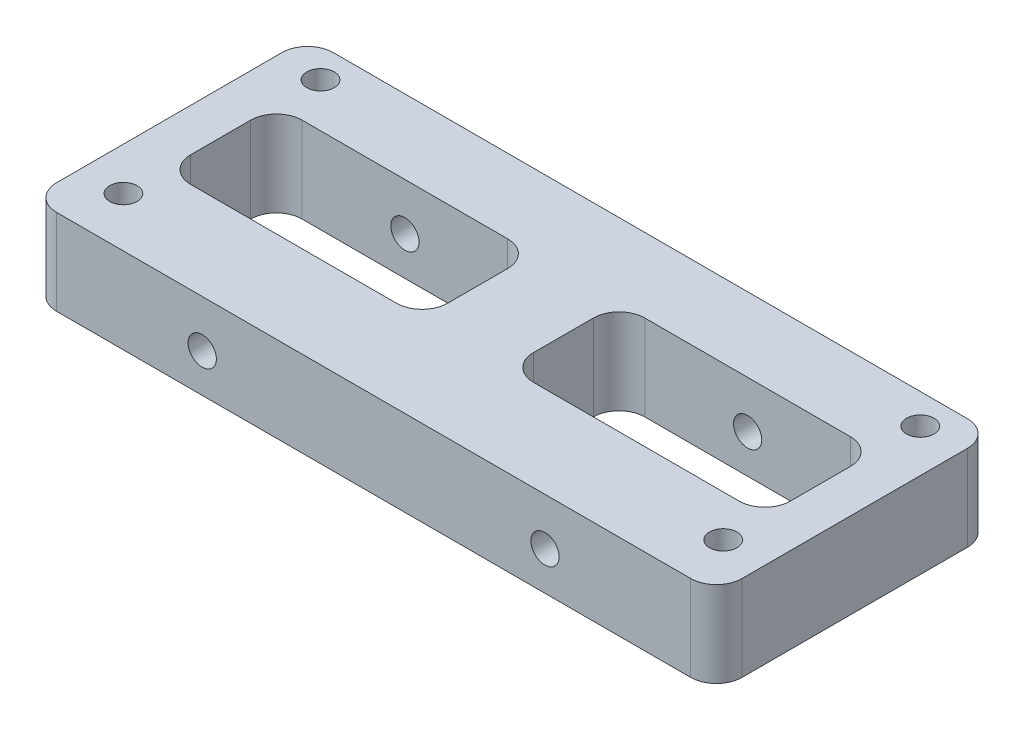
ISO-10303-21;
HEADER;
FILE_DESCRIPTION(('STEP AP214'),'2;1');
FILE_NAME('part.step','',(''),(''),'','','');
FILE_SCHEMA(('AUTOMOTIVE_DESIGN { 1 0 10303 214 1 1 1 1 }'));
ENDSEC;
DATA;
#1=APPLICATION_CONTEXT('core data for automotive mechanical design processes');
#2=APPLICATION_PROTOCOL_DEFINITION('international standard','automotive_design',2000,#1);
#3=PRODUCT_CONTEXT('',#1,'mechanical');
#4=PRODUCT('Part','Part','',(#3));
#5=PRODUCT_RELATED_PRODUCT_CATEGORY('part','',(#4));
#6=PRODUCT_DEFINITION_FORMATION('','',#4);
#7=PRODUCT_DEFINITION_CONTEXT('part definition',#1,'design');
#8=PRODUCT_DEFINITION('design','',#6,#7);
#9=PRODUCT_DEFINITION_SHAPE('','',#8);
#10=(LENGTH_UNIT() NAMED_UNIT(*) SI_UNIT(.MILLI.,.METRE.));
#11=(NAMED_UNIT(*) PLANE_ANGLE_UNIT() SI_UNIT($,.RADIAN.));
#12=(NAMED_UNIT(*) SI_UNIT($,.STERADIAN.) SOLID_ANGLE_UNIT());
#13=UNCERTAINTY_MEASURE_WITH_UNIT(LENGTH_MEASURE(1.E-05),#10,'distance_accuracy_value','');
#14=(GEOMETRIC_REPRESENTATION_CONTEXT(3) GLOBAL_UNCERTAINTY_ASSIGNED_CONTEXT((#13)) GLOBAL_UNIT_ASSIGNED_CONTEXT((#10,
#11,#12)) REPRESENTATION_CONTEXT('',''));
#15=CARTESIAN_POINT('',(0.,0.,0.));
#16=DIRECTION('',(0.,0.,1.));
#17=DIRECTION('',(1.,0.,0.));
#18=AXIS2_PLACEMENT_3D('',#15,#16,#17);
#19=CARTESIAN_POINT('',(20.,4.5,17.15));
#20=DIRECTION('',(0.,0.,-1.));
#21=DIRECTION('',(-1.,0.,0.));
#22=AXIS2_PLACEMENT_3D('',#19,#20,#21);
#23=CYLINDRICAL_SURFACE('',#22,1.65);
#24=CARTESIAN_POINT('',(20.,4.5,-6.49999999999998));
#25=DIRECTION('',(0.,0.,1.));
#26=DIRECTION('',(1.,0.,0.));
#27=AXIS2_PLACEMENT_3D('',#24,#25,#26);
#28=CIRCLE('',#27,1.65);
#29=CARTESIAN_POINT('',(21.65,4.5,-6.49999999999998));
#30=VERTEX_POINT('',#29);
#31=EDGE_CURVE('E412',#30,#30,#28,.T.);
#32=ORIENTED_EDGE('',*,*,#31,.T.);
#33=EDGE_LOOP('',(#32));
#34=FACE_BOUND('',#33,.T.);
#35=CARTESIAN_POINT('',(20.,4.5,-12.15));
#36=DIRECTION('',(0.,0.,-1.));
#37=DIRECTION('',(-1.,0.,0.));
#38=AXIS2_PLACEMENT_3D('',#35,#36,#37);
#39=CIRCLE('',#38,1.65);
#40=CARTESIAN_POINT('',(18.35,4.5,-12.15));
#41=VERTEX_POINT('',#40);
#42=EDGE_CURVE('E419',#41,#41,#39,.F.);
#43=ORIENTED_EDGE('',*,*,#42,.F.);
#44=EDGE_LOOP('',(#43));
#45=FACE_BOUND('',#44,.T.);
#46=ADVANCED_FACE('F41',(#34,#45),#23,.F.);
#47=CARTESIAN_POINT('',(0.,10.,0.));
#48=DIRECTION('',(0.,-1.,0.));
#49=DIRECTION('',(0.,0.,-1.));
#50=AXIS2_PLACEMENT_3D('',#47,#48,#49);
#51=PLANE('',#50);
#52=DIRECTION('',(0.,0.,1.));
#53=VECTOR('',#52,1.);
#54=CARTESIAN_POINT('',(-35.,10.,-6.49999999999998));
#55=LINE('',#54,#53);
#56=CARTESIAN_POINT('',(-35.,10.,-3.49999999999998));
#57=VERTEX_POINT('',#56);
#58=CARTESIAN_POINT('',(-35.,10.,3.5));
#59=VERTEX_POINT('',#58);
#60=EDGE_CURVE('E357',#57,#59,#55,.T.);
#61=ORIENTED_EDGE('',*,*,#60,.F.);
#62=CARTESIAN_POINT('',(-32.,10.,-3.49999999999998));
#63=DIRECTION('',(0.,-1.,0.));
#64=DIRECTION('',(0.,0.,-1.));
#65=AXIS2_PLACEMENT_3D('',#62,#63,#64);
#66=CIRCLE('',#65,3.);
#67=CARTESIAN_POINT('',(-32.,10.,-6.49999999999998));
#68=VERTEX_POINT('',#67);
#69=EDGE_CURVE('E11',#57,#68,#66,.T.);
#70=ORIENTED_EDGE('',*,*,#69,.T.);
#71=DIRECTION('',(-1.,0.,0.));
#72=VECTOR('',#71,1.);
#73=CARTESIAN_POINT('',(-35.,10.,-6.49999999999998));
#74=LINE('',#73,#72);
#75=CARTESIAN_POINT('',(-8.,10.,-6.49999999999998));
#76=VERTEX_POINT('',#75);
#77=EDGE_CURVE('E355',#76,#68,#74,.T.);
#78=ORIENTED_EDGE('',*,*,#77,.F.);
#79=CARTESIAN_POINT('',(-8.,10.,-3.49999999999998));
#80=DIRECTION('',(0.,-1.,0.));
#81=DIRECTION('',(0.,0.,-1.));
#82=AXIS2_PLACEMENT_3D('',#79,#80,#81);
#83=CIRCLE('',#82,3.);
#84=CARTESIAN_POINT('',(-5.,10.,-3.49999999999999));
#85=VERTEX_POINT('',#84);
#86=EDGE_CURVE('E329',#76,#85,#83,.T.);
#87=ORIENTED_EDGE('',*,*,#86,.T.);
#88=DIRECTION('',(0.,0.,-1.));
#89=VECTOR('',#88,1.);
#90=CARTESIAN_POINT('',(-5.,10.,-6.49999999999998));
#91=LINE('',#90,#89);
#92=CARTESIAN_POINT('',(-5.,10.,3.49999999999999));
#93=VERTEX_POINT('',#92);
#94=EDGE_CURVE('E362',#93,#85,#91,.T.);
#95=ORIENTED_EDGE('',*,*,#94,.F.);
#96=CARTESIAN_POINT('',(-8.,10.,3.5));
#97=DIRECTION('',(0.,-1.,0.));
#98=DIRECTION('',(0.,0.,-1.));
#99=AXIS2_PLACEMENT_3D('',#96,#97,#98);
#100=CIRCLE('',#99,3.);
#101=CARTESIAN_POINT('',(-8.,10.,6.5));
#102=VERTEX_POINT('',#101);
#103=EDGE_CURVE('E325',#93,#102,#100,.T.);
#104=ORIENTED_EDGE('',*,*,#103,.T.);
#105=DIRECTION('',(1.,0.,0.));
#106=VECTOR('',#105,1.);
#107=CARTESIAN_POINT('',(-35.,10.,6.50000000000001));
#108=LINE('',#107,#106);
#109=CARTESIAN_POINT('',(-32.,10.,6.5));
#110=VERTEX_POINT('',#109);
#111=EDGE_CURVE('E368',#110,#102,#108,.T.);
#112=ORIENTED_EDGE('',*,*,#111,.F.);
#113=CARTESIAN_POINT('',(-32.,10.,3.5));
#114=DIRECTION('',(0.,-1.,0.));
#115=DIRECTION('',(0.,0.,-1.));
#116=AXIS2_PLACEMENT_3D('',#113,#114,#115);
#117=CIRCLE('',#116,3.);
#118=EDGE_CURVE('E321',#110,#59,#117,.T.);
#119=ORIENTED_EDGE('',*,*,#118,.T.);
#120=EDGE_LOOP('',(#61,#70,#78,#87,#95,#104,#112,#119));
#121=FACE_BOUND('',#120,.T.);
#122=DIRECTION('',(1.,0.,0.));
#123=VECTOR('',#122,1.);
#124=CARTESIAN_POINT('',(-40.,10.,17.15));
#125=LINE('',#124,#123);
#126=CARTESIAN_POINT('',(-37.,10.,17.15));
#127=VERTEX_POINT('',#126);
#128=CARTESIAN_POINT('',(37.,10.,17.15));
#129=VERTEX_POINT('',#128);
#130=EDGE_CURVE('E229',#127,#129,#125,.T.);
#131=ORIENTED_EDGE('',*,*,#130,.T.);
#132=CARTESIAN_POINT('',(37.,10.,14.15));
#133=DIRECTION('',(0.,-1.,0.));
#134=DIRECTION('',(0.,0.,-1.));
#135=AXIS2_PLACEMENT_3D('',#132,#133,#134);
#136=CIRCLE('',#135,3.);
#137=CARTESIAN_POINT('',(40.,10.,14.15));
#138=VERTEX_POINT('',#137);
#139=EDGE_CURVE('E297',#129,#138,#136,.F.);
#140=ORIENTED_EDGE('',*,*,#139,.T.);
#141=DIRECTION('',(0.,0.,-1.));
#142=VECTOR('',#141,1.);
#143=CARTESIAN_POINT('',(40.,10.,17.15));
#144=LINE('',#143,#142);
#145=CARTESIAN_POINT('',(40.,10.,-12.15));
#146=VERTEX_POINT('',#145);
#147=EDGE_CURVE('E398',#138,#146,#144,.T.);
#148=ORIENTED_EDGE('',*,*,#147,.T.);
#149=CARTESIAN_POINT('',(37.,10.,-12.15));
#150=DIRECTION('',(0.,-1.,0.));
#151=DIRECTION('',(0.,0.,-1.));
#152=AXIS2_PLACEMENT_3D('',#149,#150,#151);
#153=CIRCLE('',#152,3.);
#154=CARTESIAN_POINT('',(37.,10.,-15.15));
#155=VERTEX_POINT('',#154);
#156=EDGE_CURVE('E293',#146,#155,#153,.F.);
#157=ORIENTED_EDGE('',*,*,#156,.T.);
#158=DIRECTION('',(1.,0.,0.));
#159=VECTOR('',#158,1.);
#160=CARTESIAN_POINT('',(-40.,10.,-15.15));
#161=LINE('',#160,#159);
#162=CARTESIAN_POINT('',(-37.,10.,-15.15));
#163=VERTEX_POINT('',#162);
#164=EDGE_CURVE('E536',#163,#155,#161,.T.);
#165=ORIENTED_EDGE('',*,*,#164,.F.);
#166=CARTESIAN_POINT('',(-37.,10.,-12.15));
#167=DIRECTION('',(0.,-1.,0.));
#168=DIRECTION('',(0.,0.,-1.));
#169=AXIS2_PLACEMENT_3D('',#166,#167,#168);
#170=CIRCLE('',#169,3.);
#171=CARTESIAN_POINT('',(-40.,10.,-12.15));
#172=VERTEX_POINT('',#171);
#173=EDGE_CURVE('E63',#163,#172,#170,.F.);
#174=ORIENTED_EDGE('',*,*,#173,.T.);
#175=DIRECTION('',(0.,0.,1.));
#176=VECTOR('',#175,1.);
#177=CARTESIAN_POINT('',(-40.,10.,17.15));
#178=LINE('',#177,#176);
#179=CARTESIAN_POINT('',(-40.,10.,14.15));
#180=VERTEX_POINT('',#179);
#181=EDGE_CURVE('E234',#172,#180,#178,.T.);
#182=ORIENTED_EDGE('',*,*,#181,.T.);
#183=CARTESIAN_POINT('',(-37.,10.,14.15));
#184=DIRECTION('',(0.,-1.,0.));
#185=DIRECTION('',(0.,0.,-1.));
#186=AXIS2_PLACEMENT_3D('',#183,#184,#185);
#187=CIRCLE('',#186,3.);
#188=EDGE_CURVE('E295',#180,#127,#187,.F.);
#189=ORIENTED_EDGE('',*,*,#188,.T.);
#190=EDGE_LOOP('',(#131,#140,#148,#157,#165,#174,#182,#189));
#191=FACE_BOUND('',#190,.T.);
#192=CARTESIAN_POINT('',(-35.,10.,11.35));
#193=DIRECTION('',(0.,1.,0.));
#194=DIRECTION('',(0.,0.,1.));
#195=AXIS2_PLACEMENT_3D('',#192,#193,#194);
#196=CIRCLE('',#195,1.6);
#197=CARTESIAN_POINT('',(-35.,10.,12.95));
#198=VERTEX_POINT('',#197);
#199=EDGE_CURVE('E392',#198,#198,#196,.T.);
#200=ORIENTED_EDGE('',*,*,#199,.F.);
#201=EDGE_LOOP('',(#200));
#202=FACE_BOUND('',#201,.T.);
#203=CARTESIAN_POINT('',(-35.,10.,-11.65));
#204=DIRECTION('',(0.,1.,0.));
#205=DIRECTION('',(0.,0.,1.));
#206=AXIS2_PLACEMENT_3D('',#203,#204,#205);
#207=CIRCLE('',#206,1.6);
#208=CARTESIAN_POINT('',(-35.,10.,-10.05));
#209=VERTEX_POINT('',#208);
#210=EDGE_CURVE('E386',#209,#209,#207,.T.);
#211=ORIENTED_EDGE('',*,*,#210,.F.);
#212=EDGE_LOOP('',(#211));
#213=FACE_BOUND('',#212,.T.);
#214=CARTESIAN_POINT('',(35.,10.,11.35));
#215=DIRECTION('',(0.,1.,0.));
#216=DIRECTION('',(0.,0.,-1.));
#217=AXIS2_PLACEMENT_3D('',#214,#215,#216);
#218=CIRCLE('',#217,1.6);
#219=CARTESIAN_POINT('',(35.,10.,9.75000000000001));
#220=VERTEX_POINT('',#219);
#221=EDGE_CURVE('E380',#220,#220,#218,.T.);
#222=ORIENTED_EDGE('',*,*,#221,.F.);
#223=EDGE_LOOP('',(#222));
#224=FACE_BOUND('',#223,.T.);
#225=CARTESIAN_POINT('',(35.,10.,-11.65));
#226=DIRECTION('',(0.,1.,0.));
#227=DIRECTION('',(0.,0.,-1.));
#228=AXIS2_PLACEMENT_3D('',#225,#226,#227);
#229=CIRCLE('',#228,1.6);
#230=CARTESIAN_POINT('',(35.,10.,-13.25));
#231=VERTEX_POINT('',#230);
#232=EDGE_CURVE('E365',#231,#231,#229,.T.);
#233=ORIENTED_EDGE('',*,*,#232,.F.);
#234=EDGE_LOOP('',(#233));
#235=FACE_BOUND('',#234,.T.);
#236=DIRECTION('',(-1.,0.,0.));
#237=VECTOR('',#236,1.);
#238=CARTESIAN_POINT('',(35.,10.,-6.49999999999998));
#239=LINE('',#238,#237);
#240=CARTESIAN_POINT('',(32.,10.,-6.49999999999998));
#241=VERTEX_POINT('',#240);
#242=CARTESIAN_POINT('',(8.,10.,-6.49999999999998));
#243=VERTEX_POINT('',#242);
#244=EDGE_CURVE('E437',#241,#243,#239,.T.);
#245=ORIENTED_EDGE('',*,*,#244,.F.);
#246=CARTESIAN_POINT('',(32.,10.,-3.49999999999998));
#247=DIRECTION('',(0.,-1.,0.));
#248=DIRECTION('',(0.,0.,-1.));
#249=AXIS2_PLACEMENT_3D('',#246,#247,#248);
#250=CIRCLE('',#249,3.);
#251=CARTESIAN_POINT('',(35.,10.,-3.49999999999998));
#252=VERTEX_POINT('',#251);
#253=EDGE_CURVE('E213',#241,#252,#250,.T.);
#254=ORIENTED_EDGE('',*,*,#253,.T.);
#255=DIRECTION('',(0.,0.,-1.));
#256=VECTOR('',#255,1.);
#257=CARTESIAN_POINT('',(35.,10.,-6.49999999999998));
#258=LINE('',#257,#256);
#259=CARTESIAN_POINT('',(35.,10.,3.5));
#260=VERTEX_POINT('',#259);
#261=EDGE_CURVE('E347',#260,#252,#258,.T.);
#262=ORIENTED_EDGE('',*,*,#261,.F.);
#263=CARTESIAN_POINT('',(32.,10.,3.5));
#264=DIRECTION('',(0.,-1.,0.));
#265=DIRECTION('',(0.,0.,-1.));
#266=AXIS2_PLACEMENT_3D('',#263,#264,#265);
#267=CIRCLE('',#266,3.);
#268=CARTESIAN_POINT('',(32.,10.,6.5));
#269=VERTEX_POINT('',#268);
#270=EDGE_CURVE('E214',#260,#269,#267,.T.);
#271=ORIENTED_EDGE('',*,*,#270,.T.);
#272=DIRECTION('',(1.,0.,0.));
#273=VECTOR('',#272,1.);
#274=CARTESIAN_POINT('',(35.,10.,6.50000000000001));
#275=LINE('',#274,#273);
#276=CARTESIAN_POINT('',(8.,10.,6.5));
#277=VERTEX_POINT('',#276);
#278=EDGE_CURVE('E442',#277,#269,#275,.T.);
#279=ORIENTED_EDGE('',*,*,#278,.F.);
#280=CARTESIAN_POINT('',(8.,10.,3.5));
#281=DIRECTION('',(0.,-1.,0.));
#282=DIRECTION('',(0.,0.,-1.));
#283=AXIS2_PLACEMENT_3D('',#280,#281,#282);
#284=CIRCLE('',#283,3.);
#285=CARTESIAN_POINT('',(5.,10.,3.49999999999999));
#286=VERTEX_POINT('',#285);
#287=EDGE_CURVE('E313',#277,#286,#284,.T.);
#288=ORIENTED_EDGE('',*,*,#287,.T.);
#289=DIRECTION('',(0.,0.,1.));
#290=VECTOR('',#289,1.);
#291=CARTESIAN_POINT('',(5.,10.,-6.49999999999998));
#292=LINE('',#291,#290);
#293=CARTESIAN_POINT('',(5.,10.,-3.49999999999999));
#294=VERTEX_POINT('',#293);
#295=EDGE_CURVE('E439',#294,#286,#292,.T.);
#296=ORIENTED_EDGE('',*,*,#295,.F.);
#297=CARTESIAN_POINT('',(8.,10.,-3.49999999999998));
#298=DIRECTION('',(0.,-1.,0.));
#299=DIRECTION('',(0.,0.,-1.));
#300=AXIS2_PLACEMENT_3D('',#297,#298,#299);
#301=CIRCLE('',#300,3.);
#302=EDGE_CURVE('E309',#294,#243,#301,.T.);
#303=ORIENTED_EDGE('',*,*,#302,.T.);
#304=EDGE_LOOP('',(#245,#254,#262,#271,#279,#288,#296,#303));
#305=FACE_BOUND('',#304,.T.);
#306=ADVANCED_FACE('F354',(#121,#191,#202,#213,#224,#235,#305),#51,.F.);
#307=CARTESIAN_POINT('',(0.,0.,0.));
#308=DIRECTION('',(0.,-1.,0.));
#309=DIRECTION('',(0.,0.,-1.));
#310=AXIS2_PLACEMENT_3D('',#307,#308,#309);
#311=PLANE('',#310);
#312=DIRECTION('',(0.,0.,-1.));
#313=VECTOR('',#312,1.);
#314=CARTESIAN_POINT('',(40.,0.,17.15));
#315=LINE('',#314,#313);
#316=CARTESIAN_POINT('',(40.,0.,14.15));
#317=VERTEX_POINT('',#316);
#318=CARTESIAN_POINT('',(40.,0.,-12.15));
#319=VERTEX_POINT('',#318);
#320=EDGE_CURVE('E395',#317,#319,#315,.T.);
#321=ORIENTED_EDGE('',*,*,#320,.F.);
#322=CARTESIAN_POINT('',(37.,0.,14.15));
#323=DIRECTION('',(0.,-1.,0.));
#324=DIRECTION('',(0.,0.,-1.));
#325=AXIS2_PLACEMENT_3D('',#322,#323,#324);
#326=CIRCLE('',#325,3.);
#327=CARTESIAN_POINT('',(37.,0.,17.15));
#328=VERTEX_POINT('',#327);
#329=EDGE_CURVE('E285',#317,#328,#326,.T.);
#330=ORIENTED_EDGE('',*,*,#329,.T.);
#331=DIRECTION('',(1.,0.,0.));
#332=VECTOR('',#331,1.);
#333=CARTESIAN_POINT('',(20.,0.,17.15));
#334=LINE('',#333,#332);
#335=CARTESIAN_POINT('',(-37.,0.,17.15));
#336=VERTEX_POINT('',#335);
#337=EDGE_CURVE('E401',#336,#328,#334,.T.);
#338=ORIENTED_EDGE('',*,*,#337,.F.);
#339=CARTESIAN_POINT('',(-37.,0.,14.15));
#340=DIRECTION('',(0.,-1.,0.));
#341=DIRECTION('',(0.,0.,-1.));
#342=AXIS2_PLACEMENT_3D('',#339,#340,#341);
#343=CIRCLE('',#342,3.);
#344=CARTESIAN_POINT('',(-40.,0.,14.15));
#345=VERTEX_POINT('',#344);
#346=EDGE_CURVE('E283',#336,#345,#343,.T.);
#347=ORIENTED_EDGE('',*,*,#346,.T.);
#348=DIRECTION('',(0.,0.,1.));
#349=VECTOR('',#348,1.);
#350=CARTESIAN_POINT('',(-40.,0.,17.15));
#351=LINE('',#350,#349);
#352=CARTESIAN_POINT('',(-40.,0.,-12.15));
#353=VERTEX_POINT('',#352);
#354=EDGE_CURVE('E405',#353,#345,#351,.T.);
#355=ORIENTED_EDGE('',*,*,#354,.F.);
#356=CARTESIAN_POINT('',(-37.,0.,-12.15));
#357=DIRECTION('',(0.,-1.,0.));
#358=DIRECTION('',(0.,0.,-1.));
#359=AXIS2_PLACEMENT_3D('',#356,#357,#358);
#360=CIRCLE('',#359,3.);
#361=CARTESIAN_POINT('',(-37.,0.,-15.15));
#362=VERTEX_POINT('',#361);
#363=EDGE_CURVE('E279',#353,#362,#360,.T.);
#364=ORIENTED_EDGE('',*,*,#363,.T.);
#365=DIRECTION('',(1.,0.,0.));
#366=VECTOR('',#365,1.);
#367=CARTESIAN_POINT('',(-40.,0.,-15.15));
#368=LINE('',#367,#366);
#369=CARTESIAN_POINT('',(37.,0.,-15.15));
#370=VERTEX_POINT('',#369);
#371=EDGE_CURVE('E543',#362,#370,#368,.T.);
#372=ORIENTED_EDGE('',*,*,#371,.T.);
#373=CARTESIAN_POINT('',(37.,0.,-12.15));
#374=DIRECTION('',(0.,-1.,0.));
#375=DIRECTION('',(0.,0.,-1.));
#376=AXIS2_PLACEMENT_3D('',#373,#374,#375);
#377=CIRCLE('',#376,3.);
#378=EDGE_CURVE('E281',#370,#319,#377,.T.);
#379=ORIENTED_EDGE('',*,*,#378,.T.);
#380=EDGE_LOOP('',(#321,#330,#338,#347,#355,#364,#372,#379));
#381=FACE_BOUND('',#380,.T.);
#382=CARTESIAN_POINT('',(35.,0.,11.35));
#383=DIRECTION('',(0.,1.,0.));
#384=DIRECTION('',(0.,0.,-1.));
#385=AXIS2_PLACEMENT_3D('',#382,#383,#384);
#386=CIRCLE('',#385,1.6);
#387=CARTESIAN_POINT('',(35.,0.,9.75000000000001));
#388=VERTEX_POINT('',#387);
#389=EDGE_CURVE('E378',#388,#388,#386,.T.);
#390=ORIENTED_EDGE('',*,*,#389,.T.);
#391=EDGE_LOOP('',(#390));
#392=FACE_BOUND('',#391,.T.);
#393=CARTESIAN_POINT('',(-35.,0.,11.35));
#394=DIRECTION('',(0.,1.,0.));
#395=DIRECTION('',(0.,0.,1.));
#396=AXIS2_PLACEMENT_3D('',#393,#394,#395);
#397=CIRCLE('',#396,1.6);
#398=CARTESIAN_POINT('',(-35.,0.,12.95));
#399=VERTEX_POINT('',#398);
#400=EDGE_CURVE('E389',#399,#399,#397,.T.);
#401=ORIENTED_EDGE('',*,*,#400,.T.);
#402=EDGE_LOOP('',(#401));
#403=FACE_BOUND('',#402,.T.);
#404=CARTESIAN_POINT('',(-35.,0.,-11.65));
#405=DIRECTION('',(0.,1.,0.));
#406=DIRECTION('',(0.,0.,1.));
#407=AXIS2_PLACEMENT_3D('',#404,#405,#406);
#408=CIRCLE('',#407,1.6);
#409=CARTESIAN_POINT('',(-35.,0.,-10.05));
#410=VERTEX_POINT('',#409);
#411=EDGE_CURVE('E383',#410,#410,#408,.T.);
#412=ORIENTED_EDGE('',*,*,#411,.T.);
#413=EDGE_LOOP('',(#412));
#414=FACE_BOUND('',#413,.T.);
#415=CARTESIAN_POINT('',(35.,0.,-11.65));
#416=DIRECTION('',(0.,1.,0.));
#417=DIRECTION('',(0.,0.,-1.));
#418=AXIS2_PLACEMENT_3D('',#415,#416,#417);
#419=CIRCLE('',#418,1.6);
#420=CARTESIAN_POINT('',(35.,0.,-13.25));
#421=VERTEX_POINT('',#420);
#422=EDGE_CURVE('E361',#421,#421,#419,.T.);
#423=ORIENTED_EDGE('',*,*,#422,.T.);
#424=EDGE_LOOP('',(#423));
#425=FACE_BOUND('',#424,.T.);
#426=DIRECTION('',(0.,0.,-1.));
#427=VECTOR('',#426,1.);
#428=CARTESIAN_POINT('',(-5.,0.,-6.49999999999998));
#429=LINE('',#428,#427);
#430=CARTESIAN_POINT('',(-5.,0.,3.49999999999999));
#431=VERTEX_POINT('',#430);
#432=CARTESIAN_POINT('',(-5.,0.,-3.49999999999999));
#433=VERTEX_POINT('',#432);
#434=EDGE_CURVE('E374',#431,#433,#429,.T.);
#435=ORIENTED_EDGE('',*,*,#434,.T.);
#436=CARTESIAN_POINT('',(-8.,0.,-3.49999999999998));
#437=DIRECTION('',(0.,-1.,0.));
#438=DIRECTION('',(0.,0.,-1.));
#439=AXIS2_PLACEMENT_3D('',#436,#437,#438);
#440=CIRCLE('',#439,3.);
#441=CARTESIAN_POINT('',(-8.,0.,-6.49999999999998));
#442=VERTEX_POINT('',#441);
#443=EDGE_CURVE('E327',#433,#442,#440,.F.);
#444=ORIENTED_EDGE('',*,*,#443,.T.);
#445=DIRECTION('',(-1.,0.,0.));
#446=VECTOR('',#445,1.);
#447=CARTESIAN_POINT('',(-35.,0.,-6.49999999999998));
#448=LINE('',#447,#446);
#449=CARTESIAN_POINT('',(-32.,0.,-6.49999999999998));
#450=VERTEX_POINT('',#449);
#451=EDGE_CURVE('E337',#442,#450,#448,.T.);
#452=ORIENTED_EDGE('',*,*,#451,.T.);
#453=CARTESIAN_POINT('',(-32.,0.,-3.49999999999998));
#454=DIRECTION('',(0.,-1.,0.));
#455=DIRECTION('',(0.,0.,-1.));
#456=AXIS2_PLACEMENT_3D('',#453,#454,#455);
#457=CIRCLE('',#456,3.);
#458=CARTESIAN_POINT('',(-35.,0.,-3.49999999999998));
#459=VERTEX_POINT('',#458);
#460=EDGE_CURVE('E49',#450,#459,#457,.F.);
#461=ORIENTED_EDGE('',*,*,#460,.T.);
#462=DIRECTION('',(0.,0.,1.));
#463=VECTOR('',#462,1.);
#464=CARTESIAN_POINT('',(-35.,0.,-6.49999999999998));
#465=LINE('',#464,#463);
#466=CARTESIAN_POINT('',(-35.,0.,3.5));
#467=VERTEX_POINT('',#466);
#468=EDGE_CURVE('E335',#459,#467,#465,.T.);
#469=ORIENTED_EDGE('',*,*,#468,.T.);
#470=CARTESIAN_POINT('',(-32.,0.,3.5));
#471=DIRECTION('',(0.,-1.,0.));
#472=DIRECTION('',(0.,0.,-1.));
#473=AXIS2_PLACEMENT_3D('',#470,#471,#472);
#474=CIRCLE('',#473,3.);
#475=CARTESIAN_POINT('',(-32.,0.,6.5));
#476=VERTEX_POINT('',#475);
#477=EDGE_CURVE('E319',#467,#476,#474,.F.);
#478=ORIENTED_EDGE('',*,*,#477,.T.);
#479=DIRECTION('',(1.,0.,0.));
#480=VECTOR('',#479,1.);
#481=CARTESIAN_POINT('',(-35.,0.,6.50000000000001));
#482=LINE('',#481,#480);
#483=CARTESIAN_POINT('',(-8.,0.,6.5));
#484=VERTEX_POINT('',#483);
#485=EDGE_CURVE('E346',#476,#484,#482,.T.);
#486=ORIENTED_EDGE('',*,*,#485,.T.);
#487=CARTESIAN_POINT('',(-8.,0.,3.5));
#488=DIRECTION('',(0.,-1.,0.));
#489=DIRECTION('',(0.,0.,-1.));
#490=AXIS2_PLACEMENT_3D('',#487,#488,#489);
#491=CIRCLE('',#490,3.);
#492=EDGE_CURVE('E323',#484,#431,#491,.F.);
#493=ORIENTED_EDGE('',*,*,#492,.T.);
#494=EDGE_LOOP('',(#435,#444,#452,#461,#469,#478,#486,#493));
#495=FACE_BOUND('',#494,.T.);
#496=DIRECTION('',(1.,0.,0.));
#497=VECTOR('',#496,1.);
#498=CARTESIAN_POINT('',(35.,0.,6.50000000000001));
#499=LINE('',#498,#497);
#500=CARTESIAN_POINT('',(8.,0.,6.5));
#501=VERTEX_POINT('',#500);
#502=CARTESIAN_POINT('',(32.,0.,6.5));
#503=VERTEX_POINT('',#502);
#504=EDGE_CURVE('E449',#501,#503,#499,.T.);
#505=ORIENTED_EDGE('',*,*,#504,.T.);
#506=CARTESIAN_POINT('',(32.,0.,3.5));
#507=DIRECTION('',(0.,-1.,0.));
#508=DIRECTION('',(0.,0.,-1.));
#509=AXIS2_PLACEMENT_3D('',#506,#507,#508);
#510=CIRCLE('',#509,3.);
#511=CARTESIAN_POINT('',(35.,0.,3.5));
#512=VERTEX_POINT('',#511);
#513=EDGE_CURVE('E315',#503,#512,#510,.F.);
#514=ORIENTED_EDGE('',*,*,#513,.T.);
#515=DIRECTION('',(0.,0.,-1.));
#516=VECTOR('',#515,1.);
#517=CARTESIAN_POINT('',(35.,0.,-6.49999999999998));
#518=LINE('',#517,#516);
#519=CARTESIAN_POINT('',(35.,0.,-3.49999999999998));
#520=VERTEX_POINT('',#519);
#521=EDGE_CURVE('E208',#512,#520,#518,.T.);
#522=ORIENTED_EDGE('',*,*,#521,.T.);
#523=CARTESIAN_POINT('',(32.,0.,-3.49999999999998));
#524=DIRECTION('',(0.,-1.,0.));
#525=DIRECTION('',(0.,0.,-1.));
#526=AXIS2_PLACEMENT_3D('',#523,#524,#525);
#527=CIRCLE('',#526,3.);
#528=CARTESIAN_POINT('',(32.,0.,-6.49999999999998));
#529=VERTEX_POINT('',#528);
#530=EDGE_CURVE('E202',#520,#529,#527,.F.);
#531=ORIENTED_EDGE('',*,*,#530,.T.);
#532=DIRECTION('',(-1.,0.,0.));
#533=VECTOR('',#532,1.);
#534=CARTESIAN_POINT('',(35.,0.,-6.49999999999998));
#535=LINE('',#534,#533);
#536=CARTESIAN_POINT('',(8.,0.,-6.49999999999998));
#537=VERTEX_POINT('',#536);
#538=EDGE_CURVE('E206',#529,#537,#535,.T.);
#539=ORIENTED_EDGE('',*,*,#538,.T.);
#540=CARTESIAN_POINT('',(8.,0.,-3.49999999999998));
#541=DIRECTION('',(0.,-1.,0.));
#542=DIRECTION('',(0.,0.,-1.));
#543=AXIS2_PLACEMENT_3D('',#540,#541,#542);
#544=CIRCLE('',#543,3.);
#545=CARTESIAN_POINT('',(5.,0.,-3.49999999999999));
#546=VERTEX_POINT('',#545);
#547=EDGE_CURVE('E307',#537,#546,#544,.F.);
#548=ORIENTED_EDGE('',*,*,#547,.T.);
#549=DIRECTION('',(0.,0.,1.));
#550=VECTOR('',#549,1.);
#551=CARTESIAN_POINT('',(5.,0.,-6.49999999999998));
#552=LINE('',#551,#550);
#553=CARTESIAN_POINT('',(5.,0.,3.49999999999999));
#554=VERTEX_POINT('',#553);
#555=EDGE_CURVE('E224',#546,#554,#552,.T.);
#556=ORIENTED_EDGE('',*,*,#555,.T.);
#557=CARTESIAN_POINT('',(8.,0.,3.5));
#558=DIRECTION('',(0.,-1.,0.));
#559=DIRECTION('',(0.,0.,-1.));
#560=AXIS2_PLACEMENT_3D('',#557,#558,#559);
#561=CIRCLE('',#560,3.);
#562=EDGE_CURVE('E311',#554,#501,#561,.F.);
#563=ORIENTED_EDGE('',*,*,#562,.T.);
#564=EDGE_LOOP('',(#505,#514,#522,#531,#539,#548,#556,#563));
#565=FACE_BOUND('',#564,.T.);
#566=ADVANCED_FACE('F205',(#381,#392,#403,#414,#425,#495,#565),#311,.T.);
#567=CARTESIAN_POINT('',(40.,10.,17.15));
#568=DIRECTION('',(-1.,0.,0.));
#569=DIRECTION('',(0.,0.,1.));
#570=AXIS2_PLACEMENT_3D('',#567,#568,#569);
#571=PLANE('',#570);
#572=ORIENTED_EDGE('',*,*,#147,.F.);
#573=DIRECTION('',(0.,-1.,0.));
#574=VECTOR('',#573,1.);
#575=CARTESIAN_POINT('',(40.,10.,14.15));
#576=LINE('',#575,#574);
#577=EDGE_CURVE('E276',#138,#317,#576,.T.);
#578=ORIENTED_EDGE('',*,*,#577,.T.);
#579=ORIENTED_EDGE('',*,*,#320,.T.);
#580=DIRECTION('',(0.,1.,0.));
#581=VECTOR('',#580,1.);
#582=CARTESIAN_POINT('',(40.,10.,-12.15));
#583=LINE('',#582,#581);
#584=EDGE_CURVE('E273',#319,#146,#583,.T.);
#585=ORIENTED_EDGE('',*,*,#584,.T.);
#586=EDGE_LOOP('',(#572,#578,#579,#585));
#587=FACE_BOUND('',#586,.T.);
#588=ADVANCED_FACE('F528',(#587),#571,.F.);
#589=CARTESIAN_POINT('',(-40.,10.,17.15));
#590=DIRECTION('',(1.,0.,0.));
#591=DIRECTION('',(0.,0.,-1.));
#592=AXIS2_PLACEMENT_3D('',#589,#590,#591);
#593=PLANE('',#592);
#594=ORIENTED_EDGE('',*,*,#354,.T.);
#595=DIRECTION('',(0.,-1.,0.));
#596=VECTOR('',#595,1.);
#597=CARTESIAN_POINT('',(-40.,10.,14.15));
#598=LINE('',#597,#596);
#599=EDGE_CURVE('E56',#345,#180,#598,.F.);
#600=ORIENTED_EDGE('',*,*,#599,.T.);
#601=ORIENTED_EDGE('',*,*,#181,.F.);
#602=DIRECTION('',(0.,1.,0.));
#603=VECTOR('',#602,1.);
#604=CARTESIAN_POINT('',(-40.,10.,-12.15));
#605=LINE('',#604,#603);
#606=EDGE_CURVE('E299',#172,#353,#605,.F.);
#607=ORIENTED_EDGE('',*,*,#606,.T.);
#608=EDGE_LOOP('',(#594,#600,#601,#607));
#609=FACE_BOUND('',#608,.T.);
#610=ADVANCED_FACE('F514',(#609),#593,.F.);
#611=CARTESIAN_POINT('',(20.,10.,17.15));
#612=DIRECTION('',(0.,0.,-1.));
#613=DIRECTION('',(-1.,0.,0.));
#614=AXIS2_PLACEMENT_3D('',#611,#612,#613);
#615=PLANE('',#614);
#616=CARTESIAN_POINT('',(20.,4.5,17.15));
#617=DIRECTION('',(0.,0.,-1.));
#618=DIRECTION('',(-1.,0.,0.));
#619=AXIS2_PLACEMENT_3D('',#616,#617,#618);
#620=CIRCLE('',#619,1.65);
#621=CARTESIAN_POINT('',(18.35,4.5,17.15));
#622=VERTEX_POINT('',#621);
#623=EDGE_CURVE('E413',#622,#622,#620,.T.);
#624=ORIENTED_EDGE('',*,*,#623,.T.);
#625=EDGE_LOOP('',(#624));
#626=FACE_BOUND('',#625,.T.);
#627=CARTESIAN_POINT('',(-20.,4.5,17.15));
#628=DIRECTION('',(0.,0.,-1.));
#629=DIRECTION('',(1.,0.,0.));
#630=AXIS2_PLACEMENT_3D('',#627,#628,#629);
#631=CIRCLE('',#630,1.65);
#632=CARTESIAN_POINT('',(-18.35,4.5,17.15));
#633=VERTEX_POINT('',#632);
#634=EDGE_CURVE('E422',#633,#633,#631,.T.);
#635=ORIENTED_EDGE('',*,*,#634,.T.);
#636=EDGE_LOOP('',(#635));
#637=FACE_BOUND('',#636,.T.);
#638=ORIENTED_EDGE('',*,*,#337,.T.);
#639=DIRECTION('',(0.,-1.,0.));
#640=VECTOR('',#639,1.);
#641=CARTESIAN_POINT('',(37.,10.,17.15));
#642=LINE('',#641,#640);
#643=EDGE_CURVE('E290',#328,#129,#642,.F.);
#644=ORIENTED_EDGE('',*,*,#643,.T.);
#645=ORIENTED_EDGE('',*,*,#130,.F.);
#646=DIRECTION('',(0.,-1.,0.));
#647=VECTOR('',#646,1.);
#648=CARTESIAN_POINT('',(-37.,10.,17.15));
#649=LINE('',#648,#647);
#650=EDGE_CURVE('E287',#127,#336,#649,.T.);
#651=ORIENTED_EDGE('',*,*,#650,.T.);
#652=EDGE_LOOP('',(#638,#644,#645,#651));
#653=FACE_BOUND('',#652,.T.);
#654=ADVANCED_FACE('F511',(#626,#637,#653),#615,.F.);
#655=CARTESIAN_POINT('',(-35.,10.,11.35));
#656=DIRECTION('',(0.,-1.,0.));
#657=DIRECTION('',(0.,0.,-1.));
#658=AXIS2_PLACEMENT_3D('',#655,#656,#657);
#659=CYLINDRICAL_SURFACE('',#658,1.6);
#660=ORIENTED_EDGE('',*,*,#199,.T.);
#661=EDGE_LOOP('',(#660));
#662=FACE_BOUND('',#661,.T.);
#663=ORIENTED_EDGE('',*,*,#400,.F.);
#664=EDGE_LOOP('',(#663));
#665=FACE_BOUND('',#664,.T.);
#666=ADVANCED_FACE('F513',(#662,#665),#659,.F.);
#667=CARTESIAN_POINT('',(-35.,10.,-11.65));
#668=DIRECTION('',(0.,-1.,0.));
#669=DIRECTION('',(0.,0.,-1.));
#670=AXIS2_PLACEMENT_3D('',#667,#668,#669);
#671=CYLINDRICAL_SURFACE('',#670,1.6);
#672=ORIENTED_EDGE('',*,*,#210,.T.);
#673=EDGE_LOOP('',(#672));
#674=FACE_BOUND('',#673,.T.);
#675=ORIENTED_EDGE('',*,*,#411,.F.);
#676=EDGE_LOOP('',(#675));
#677=FACE_BOUND('',#676,.T.);
#678=ADVANCED_FACE('F674',(#674,#677),#671,.F.);
#679=CARTESIAN_POINT('',(35.,10.,11.35));
#680=DIRECTION('',(0.,-1.,0.));
#681=DIRECTION('',(0.,0.,-1.));
#682=AXIS2_PLACEMENT_3D('',#679,#680,#681);
#683=CYLINDRICAL_SURFACE('',#682,1.6);
#684=ORIENTED_EDGE('',*,*,#221,.T.);
#685=EDGE_LOOP('',(#684));
#686=FACE_BOUND('',#685,.T.);
#687=ORIENTED_EDGE('',*,*,#389,.F.);
#688=EDGE_LOOP('',(#687));
#689=FACE_BOUND('',#688,.T.);
#690=ADVANCED_FACE('F678',(#686,#689),#683,.F.);
#691=CARTESIAN_POINT('',(35.,10.,-11.65));
#692=DIRECTION('',(0.,-1.,0.));
#693=DIRECTION('',(0.,0.,-1.));
#694=AXIS2_PLACEMENT_3D('',#691,#692,#693);
#695=CYLINDRICAL_SURFACE('',#694,1.6);
#696=ORIENTED_EDGE('',*,*,#232,.T.);
#697=EDGE_LOOP('',(#696));
#698=FACE_BOUND('',#697,.T.);
#699=ORIENTED_EDGE('',*,*,#422,.F.);
#700=EDGE_LOOP('',(#699));
#701=FACE_BOUND('',#700,.T.);
#702=ADVANCED_FACE('F682',(#698,#701),#695,.F.);
#703=CARTESIAN_POINT('',(-35.,10.,-6.49999999999998));
#704=DIRECTION('',(1.,0.,0.));
#705=DIRECTION('',(0.,0.,-1.));
#706=AXIS2_PLACEMENT_3D('',#703,#704,#705);
#707=PLANE('',#706);
#708=ORIENTED_EDGE('',*,*,#60,.T.);
#709=DIRECTION('',(0.,-1.,0.));
#710=VECTOR('',#709,1.);
#711=CARTESIAN_POINT('',(-35.,0.,3.5));
#712=LINE('',#711,#710);
#713=EDGE_CURVE('E255',#59,#467,#712,.T.);
#714=ORIENTED_EDGE('',*,*,#713,.T.);
#715=ORIENTED_EDGE('',*,*,#468,.F.);
#716=DIRECTION('',(0.,-1.,0.));
#717=VECTOR('',#716,1.);
#718=CARTESIAN_POINT('',(-35.,10.,-3.49999999999998));
#719=LINE('',#718,#717);
#720=EDGE_CURVE('E253',#459,#57,#719,.F.);
#721=ORIENTED_EDGE('',*,*,#720,.T.);
#722=EDGE_LOOP('',(#708,#714,#715,#721));
#723=FACE_BOUND('',#722,.T.);
#724=ADVANCED_FACE('F343',(#723),#707,.T.);
#725=CARTESIAN_POINT('',(-35.,10.,6.50000000000001));
#726=DIRECTION('',(0.,0.,-1.));
#727=DIRECTION('',(-1.,0.,0.));
#728=AXIS2_PLACEMENT_3D('',#725,#726,#727);
#729=PLANE('',#728);
#730=CARTESIAN_POINT('',(-20.,4.5,6.5));
#731=DIRECTION('',(0.,0.,-1.));
#732=DIRECTION('',(-1.,0.,0.));
#733=AXIS2_PLACEMENT_3D('',#730,#731,#732);
#734=CIRCLE('',#733,1.65);
#735=CARTESIAN_POINT('',(-21.65,4.5,6.5));
#736=VERTEX_POINT('',#735);
#737=EDGE_CURVE('E225',#736,#736,#734,.T.);
#738=ORIENTED_EDGE('',*,*,#737,.F.);
#739=EDGE_LOOP('',(#738));
#740=FACE_BOUND('',#739,.T.);
#741=ORIENTED_EDGE('',*,*,#485,.F.);
#742=DIRECTION('',(0.,-1.,0.));
#743=VECTOR('',#742,1.);
#744=CARTESIAN_POINT('',(-32.,10.,6.5));
#745=LINE('',#744,#743);
#746=EDGE_CURVE('E261',#476,#110,#745,.F.);
#747=ORIENTED_EDGE('',*,*,#746,.T.);
#748=ORIENTED_EDGE('',*,*,#111,.T.);
#749=DIRECTION('',(0.,-1.,0.));
#750=VECTOR('',#749,1.);
#751=CARTESIAN_POINT('',(-8.,0.,6.5));
#752=LINE('',#751,#750);
#753=EDGE_CURVE('E258',#102,#484,#752,.T.);
#754=ORIENTED_EDGE('',*,*,#753,.T.);
#755=EDGE_LOOP('',(#741,#747,#748,#754));
#756=FACE_BOUND('',#755,.T.);
#757=ADVANCED_FACE('F457',(#740,#756),#729,.T.);
#758=CARTESIAN_POINT('',(-5.,10.,-6.49999999999998));
#759=DIRECTION('',(-1.,0.,0.));
#760=DIRECTION('',(0.,0.,1.));
#761=AXIS2_PLACEMENT_3D('',#758,#759,#760);
#762=PLANE('',#761);
#763=ORIENTED_EDGE('',*,*,#434,.F.);
#764=DIRECTION('',(0.,-1.,0.));
#765=VECTOR('',#764,1.);
#766=CARTESIAN_POINT('',(-5.,10.,3.5));
#767=LINE('',#766,#765);
#768=EDGE_CURVE('E266',#431,#93,#767,.F.);
#769=ORIENTED_EDGE('',*,*,#768,.T.);
#770=ORIENTED_EDGE('',*,*,#94,.T.);
#771=DIRECTION('',(0.,-1.,0.));
#772=VECTOR('',#771,1.);
#773=CARTESIAN_POINT('',(-5.,0.,-3.49999999999998));
#774=LINE('',#773,#772);
#775=EDGE_CURVE('E263',#85,#433,#774,.T.);
#776=ORIENTED_EDGE('',*,*,#775,.T.);
#777=EDGE_LOOP('',(#763,#769,#770,#776));
#778=FACE_BOUND('',#777,.T.);
#779=ADVANCED_FACE('F466',(#778),#762,.T.);
#780=CARTESIAN_POINT('',(-35.,10.,-6.49999999999998));
#781=DIRECTION('',(0.,0.,1.));
#782=DIRECTION('',(1.,0.,0.));
#783=AXIS2_PLACEMENT_3D('',#780,#781,#782);
#784=PLANE('',#783);
#785=CARTESIAN_POINT('',(-20.,4.5,-6.49999999999998));
#786=DIRECTION('',(0.,0.,1.));
#787=DIRECTION('',(1.,0.,0.));
#788=AXIS2_PLACEMENT_3D('',#785,#786,#787);
#789=CIRCLE('',#788,1.65);
#790=CARTESIAN_POINT('',(-18.35,4.5,-6.49999999999998));
#791=VERTEX_POINT('',#790);
#792=EDGE_CURVE('E414',#791,#791,#789,.T.);
#793=ORIENTED_EDGE('',*,*,#792,.F.);
#794=EDGE_LOOP('',(#793));
#795=FACE_BOUND('',#794,.T.);
#796=ORIENTED_EDGE('',*,*,#451,.F.);
#797=DIRECTION('',(0.,-1.,0.));
#798=VECTOR('',#797,1.);
#799=CARTESIAN_POINT('',(-8.,10.,-6.49999999999998));
#800=LINE('',#799,#798);
#801=EDGE_CURVE('E271',#442,#76,#800,.F.);
#802=ORIENTED_EDGE('',*,*,#801,.T.);
#803=ORIENTED_EDGE('',*,*,#77,.T.);
#804=DIRECTION('',(0.,-1.,0.));
#805=VECTOR('',#804,1.);
#806=CARTESIAN_POINT('',(-32.,0.,-6.49999999999998));
#807=LINE('',#806,#805);
#808=EDGE_CURVE('E268',#68,#450,#807,.T.);
#809=ORIENTED_EDGE('',*,*,#808,.T.);
#810=EDGE_LOOP('',(#796,#802,#803,#809));
#811=FACE_BOUND('',#810,.T.);
#812=ADVANCED_FACE('F359',(#795,#811),#784,.T.);
#813=CARTESIAN_POINT('',(35.,10.,-6.49999999999998));
#814=DIRECTION('',(0.,0.,1.));
#815=DIRECTION('',(1.,0.,0.));
#816=AXIS2_PLACEMENT_3D('',#813,#814,#815);
#817=PLANE('',#816);
#818=ORIENTED_EDGE('',*,*,#31,.F.);
#819=EDGE_LOOP('',(#818));
#820=FACE_BOUND('',#819,.T.);
#821=ORIENTED_EDGE('',*,*,#244,.T.);
#822=DIRECTION('',(0.,-1.,0.));
#823=VECTOR('',#822,1.);
#824=CARTESIAN_POINT('',(8.,0.,-6.49999999999998));
#825=LINE('',#824,#823);
#826=EDGE_CURVE('E223',#243,#537,#825,.T.);
#827=ORIENTED_EDGE('',*,*,#826,.T.);
#828=ORIENTED_EDGE('',*,*,#538,.F.);
#829=DIRECTION('',(0.,-1.,0.));
#830=VECTOR('',#829,1.);
#831=CARTESIAN_POINT('',(32.,10.,-6.49999999999998));
#832=LINE('',#831,#830);
#833=EDGE_CURVE('E220',#529,#241,#832,.F.);
#834=ORIENTED_EDGE('',*,*,#833,.T.);
#835=EDGE_LOOP('',(#821,#827,#828,#834));
#836=FACE_BOUND('',#835,.T.);
#837=ADVANCED_FACE('F219',(#820,#836),#817,.T.);
#838=CARTESIAN_POINT('',(5.,10.,-6.49999999999998));
#839=DIRECTION('',(1.,0.,0.));
#840=DIRECTION('',(0.,0.,-1.));
#841=AXIS2_PLACEMENT_3D('',#838,#839,#840);
#842=PLANE('',#841);
#843=ORIENTED_EDGE('',*,*,#555,.F.);
#844=DIRECTION('',(0.,-1.,0.));
#845=VECTOR('',#844,1.);
#846=CARTESIAN_POINT('',(5.,10.,-3.49999999999998));
#847=LINE('',#846,#845);
#848=EDGE_CURVE('E242',#546,#294,#847,.F.);
#849=ORIENTED_EDGE('',*,*,#848,.T.);
#850=ORIENTED_EDGE('',*,*,#295,.T.);
#851=DIRECTION('',(0.,-1.,0.));
#852=VECTOR('',#851,1.);
#853=CARTESIAN_POINT('',(5.,0.,3.5));
#854=LINE('',#853,#852);
#855=EDGE_CURVE('E231',#286,#554,#854,.T.);
#856=ORIENTED_EDGE('',*,*,#855,.T.);
#857=EDGE_LOOP('',(#843,#849,#850,#856));
#858=FACE_BOUND('',#857,.T.);
#859=ADVANCED_FACE('F698',(#858),#842,.T.);
#860=CARTESIAN_POINT('',(35.,10.,6.50000000000001));
#861=DIRECTION('',(0.,0.,-1.));
#862=DIRECTION('',(-1.,0.,0.));
#863=AXIS2_PLACEMENT_3D('',#860,#861,#862);
#864=PLANE('',#863);
#865=CARTESIAN_POINT('',(20.,4.5,6.5));
#866=DIRECTION('',(0.,0.,-1.));
#867=DIRECTION('',(-1.,0.,0.));
#868=AXIS2_PLACEMENT_3D('',#865,#866,#867);
#869=CIRCLE('',#868,1.65);
#870=CARTESIAN_POINT('',(18.35,4.5,6.5));
#871=VERTEX_POINT('',#870);
#872=EDGE_CURVE('E409',#871,#871,#869,.T.);
#873=ORIENTED_EDGE('',*,*,#872,.F.);
#874=EDGE_LOOP('',(#873));
#875=FACE_BOUND('',#874,.T.);
#876=ORIENTED_EDGE('',*,*,#504,.F.);
#877=DIRECTION('',(0.,-1.,0.));
#878=VECTOR('',#877,1.);
#879=CARTESIAN_POINT('',(8.,10.,6.5));
#880=LINE('',#879,#878);
#881=EDGE_CURVE('E247',#501,#277,#880,.F.);
#882=ORIENTED_EDGE('',*,*,#881,.T.);
#883=ORIENTED_EDGE('',*,*,#278,.T.);
#884=DIRECTION('',(0.,-1.,0.));
#885=VECTOR('',#884,1.);
#886=CARTESIAN_POINT('',(32.,0.,6.5));
#887=LINE('',#886,#885);
#888=EDGE_CURVE('E244',#269,#503,#887,.T.);
#889=ORIENTED_EDGE('',*,*,#888,.T.);
#890=EDGE_LOOP('',(#876,#882,#883,#889));
#891=FACE_BOUND('',#890,.T.);
#892=ADVANCED_FACE('F504',(#875,#891),#864,.T.);
#893=CARTESIAN_POINT('',(35.,10.,-6.49999999999998));
#894=DIRECTION('',(-1.,0.,0.));
#895=DIRECTION('',(0.,0.,1.));
#896=AXIS2_PLACEMENT_3D('',#893,#894,#895);
#897=PLANE('',#896);
#898=ORIENTED_EDGE('',*,*,#521,.F.);
#899=DIRECTION('',(0.,-1.,0.));
#900=VECTOR('',#899,1.);
#901=CARTESIAN_POINT('',(35.,10.,3.5));
#902=LINE('',#901,#900);
#903=EDGE_CURVE('E251',#512,#260,#902,.F.);
#904=ORIENTED_EDGE('',*,*,#903,.T.);
#905=ORIENTED_EDGE('',*,*,#261,.T.);
#906=DIRECTION('',(0.,-1.,0.));
#907=VECTOR('',#906,1.);
#908=CARTESIAN_POINT('',(35.,0.,-3.49999999999998));
#909=LINE('',#908,#907);
#910=EDGE_CURVE('E249',#252,#520,#909,.T.);
#911=ORIENTED_EDGE('',*,*,#910,.T.);
#912=EDGE_LOOP('',(#898,#904,#905,#911));
#913=FACE_BOUND('',#912,.T.);
#914=ADVANCED_FACE('F496',(#913),#897,.T.);
#915=ORIENTED_EDGE('',*,*,#872,.T.);
#916=EDGE_LOOP('',(#915));
#917=FACE_BOUND('',#916,.T.);
#918=ORIENTED_EDGE('',*,*,#623,.F.);
#919=EDGE_LOOP('',(#918));
#920=FACE_BOUND('',#919,.T.);
#921=ADVANCED_FACE('F484',(#917,#920),#23,.F.);
#922=CARTESIAN_POINT('',(-20.,4.5,17.15));
#923=DIRECTION('',(0.,0.,-1.));
#924=DIRECTION('',(-1.,0.,0.));
#925=AXIS2_PLACEMENT_3D('',#922,#923,#924);
#926=CYLINDRICAL_SURFACE('',#925,1.65);
#927=CARTESIAN_POINT('',(-20.,4.5,-12.15));
#928=DIRECTION('',(0.,0.,1.));
#929=DIRECTION('',(1.,0.,0.));
#930=AXIS2_PLACEMENT_3D('',#927,#928,#929);
#931=CIRCLE('',#930,1.65);
#932=CARTESIAN_POINT('',(-18.35,4.5,-12.15));
#933=VERTEX_POINT('',#932);
#934=EDGE_CURVE('E417',#933,#933,#931,.F.);
#935=ORIENTED_EDGE('',*,*,#934,.T.);
#936=EDGE_LOOP('',(#935));
#937=FACE_BOUND('',#936,.T.);
#938=ORIENTED_EDGE('',*,*,#792,.T.);
#939=EDGE_LOOP('',(#938));
#940=FACE_BOUND('',#939,.T.);
#941=ADVANCED_FACE('F495',(#937,#940),#926,.F.);
#942=ORIENTED_EDGE('',*,*,#737,.T.);
#943=EDGE_LOOP('',(#942));
#944=FACE_BOUND('',#943,.T.);
#945=ORIENTED_EDGE('',*,*,#634,.F.);
#946=EDGE_LOOP('',(#945));
#947=FACE_BOUND('',#946,.T.);
#948=ADVANCED_FACE('F501',(#944,#947),#926,.F.);
#949=CARTESIAN_POINT('',(-20.,4.5,-12.15));
#950=DIRECTION('',(0.,0.,1.));
#951=DIRECTION('',(1.,0.,0.));
#952=AXIS2_PLACEMENT_3D('',#949,#950,#951);
#953=PLANE('',#952);
#954=CARTESIAN_POINT('',(-20.,4.5,-12.15));
#955=DIRECTION('',(0.,0.,-1.));
#956=DIRECTION('',(1.,0.,0.));
#957=AXIS2_PLACEMENT_3D('',#954,#955,#956);
#958=CIRCLE('',#957,3.);
#959=CARTESIAN_POINT('',(-17.,4.5,-12.15));
#960=VERTEX_POINT('',#959);
#961=EDGE_CURVE('E550',#960,#960,#958,.T.);
#962=ORIENTED_EDGE('',*,*,#961,.T.);
#963=EDGE_LOOP('',(#962));
#964=FACE_BOUND('',#963,.T.);
#965=ORIENTED_EDGE('',*,*,#934,.F.);
#966=EDGE_LOOP('',(#965));
#967=FACE_BOUND('',#966,.T.);
#968=ADVANCED_FACE('F555',(#964,#967),#953,.F.);
#969=CARTESIAN_POINT('',(-20.,4.5,-12.15));
#970=DIRECTION('',(0.,0.,-1.));
#971=DIRECTION('',(-1.,0.,0.));
#972=AXIS2_PLACEMENT_3D('',#969,#970,#971);
#973=CYLINDRICAL_SURFACE('',#972,3.);
#974=CARTESIAN_POINT('',(-20.,4.5,-15.15));
#975=DIRECTION('',(0.,0.,1.));
#976=DIRECTION('',(1.,0.,0.));
#977=AXIS2_PLACEMENT_3D('',#974,#975,#976);
#978=CIRCLE('',#977,3.);
#979=CARTESIAN_POINT('',(-17.,4.5,-15.15));
#980=VERTEX_POINT('',#979);
#981=EDGE_CURVE('E547',#980,#980,#978,.F.);
#982=ORIENTED_EDGE('',*,*,#981,.T.);
#983=EDGE_LOOP('',(#982));
#984=FACE_BOUND('',#983,.T.);
#985=ORIENTED_EDGE('',*,*,#961,.F.);
#986=EDGE_LOOP('',(#985));
#987=FACE_BOUND('',#986,.T.);
#988=ADVANCED_FACE('F558',(#984,#987),#973,.F.);
#989=CARTESIAN_POINT('',(20.,4.5,-12.15));
#990=DIRECTION('',(0.,0.,-1.));
#991=DIRECTION('',(-1.,0.,0.));
#992=AXIS2_PLACEMENT_3D('',#989,#990,#991);
#993=PLANE('',#992);
#994=CARTESIAN_POINT('',(20.,4.5,-12.15));
#995=DIRECTION('',(0.,0.,-1.));
#996=DIRECTION('',(-1.,0.,0.));
#997=AXIS2_PLACEMENT_3D('',#994,#995,#996);
#998=CIRCLE('',#997,3.);
#999=CARTESIAN_POINT('',(17.,4.5,-12.15));
#1000=VERTEX_POINT('',#999);
#1001=EDGE_CURVE('E420',#1000,#1000,#998,.T.);
#1002=ORIENTED_EDGE('',*,*,#1001,.T.);
#1003=EDGE_LOOP('',(#1002));
#1004=FACE_BOUND('',#1003,.T.);
#1005=ORIENTED_EDGE('',*,*,#42,.T.);
#1006=EDGE_LOOP('',(#1005));
#1007=FACE_BOUND('',#1006,.T.);
#1008=ADVANCED_FACE('F560',(#1004,#1007),#993,.T.);
#1009=CARTESIAN_POINT('',(20.,4.5,-12.15));
#1010=DIRECTION('',(0.,0.,-1.));
#1011=DIRECTION('',(-1.,0.,0.));
#1012=AXIS2_PLACEMENT_3D('',#1009,#1010,#1011);
#1013=CYLINDRICAL_SURFACE('',#1012,3.);
#1014=CARTESIAN_POINT('',(20.,4.5,-15.15));
#1015=DIRECTION('',(0.,0.,1.));
#1016=DIRECTION('',(1.,0.,0.));
#1017=AXIS2_PLACEMENT_3D('',#1014,#1015,#1016);
#1018=CIRCLE('',#1017,3.);
#1019=CARTESIAN_POINT('',(23.,4.5,-15.15));
#1020=VERTEX_POINT('',#1019);
#1021=EDGE_CURVE('E237',#1020,#1020,#1018,.F.);
#1022=ORIENTED_EDGE('',*,*,#1021,.T.);
#1023=EDGE_LOOP('',(#1022));
#1024=FACE_BOUND('',#1023,.T.);
#1025=ORIENTED_EDGE('',*,*,#1001,.F.);
#1026=EDGE_LOOP('',(#1025));
#1027=FACE_BOUND('',#1026,.T.);
#1028=ADVANCED_FACE('F567',(#1024,#1027),#1013,.F.);
#1029=CARTESIAN_POINT('',(-40.,0.,-15.15));
#1030=DIRECTION('',(0.,0.,1.));
#1031=DIRECTION('',(1.,0.,0.));
#1032=AXIS2_PLACEMENT_3D('',#1029,#1030,#1031);
#1033=PLANE('',#1032);
#1034=ORIENTED_EDGE('',*,*,#1021,.F.);
#1035=EDGE_LOOP('',(#1034));
#1036=FACE_BOUND('',#1035,.T.);
#1037=ORIENTED_EDGE('',*,*,#164,.T.);
#1038=DIRECTION('',(0.,1.,0.));
#1039=VECTOR('',#1038,1.);
#1040=CARTESIAN_POINT('',(37.,0.,-15.15));
#1041=LINE('',#1040,#1039);
#1042=EDGE_CURVE('E305',#155,#370,#1041,.F.);
#1043=ORIENTED_EDGE('',*,*,#1042,.T.);
#1044=ORIENTED_EDGE('',*,*,#371,.F.);
#1045=DIRECTION('',(0.,1.,0.));
#1046=VECTOR('',#1045,1.);
#1047=CARTESIAN_POINT('',(-37.,0.,-15.15));
#1048=LINE('',#1047,#1046);
#1049=EDGE_CURVE('E302',#362,#163,#1048,.T.);
#1050=ORIENTED_EDGE('',*,*,#1049,.T.);
#1051=EDGE_LOOP('',(#1037,#1043,#1044,#1050));
#1052=FACE_BOUND('',#1051,.T.);
#1053=ORIENTED_EDGE('',*,*,#981,.F.);
#1054=EDGE_LOOP('',(#1053));
#1055=FACE_BOUND('',#1054,.T.);
#1056=ADVANCED_FACE('F538',(#1036,#1052,#1055),#1033,.F.);
#1057=CARTESIAN_POINT('',(8.,10.,-3.49999999999998));
#1058=DIRECTION('',(0.,1.,0.));
#1059=DIRECTION('',(0.,0.,1.));
#1060=AXIS2_PLACEMENT_3D('',#1057,#1058,#1059);
#1061=CYLINDRICAL_SURFACE('',#1060,3.);
#1062=ORIENTED_EDGE('',*,*,#302,.F.);
#1063=ORIENTED_EDGE('',*,*,#848,.F.);
#1064=ORIENTED_EDGE('',*,*,#547,.F.);
#1065=ORIENTED_EDGE('',*,*,#826,.F.);
#1066=EDGE_LOOP('',(#1062,#1063,#1064,#1065));
#1067=FACE_BOUND('',#1066,.T.);
#1068=ADVANCED_FACE('F575',(#1067),#1061,.F.);
#1069=CARTESIAN_POINT('',(8.,10.,3.5));
#1070=DIRECTION('',(0.,1.,0.));
#1071=DIRECTION('',(0.,0.,1.));
#1072=AXIS2_PLACEMENT_3D('',#1069,#1070,#1071);
#1073=CYLINDRICAL_SURFACE('',#1072,3.);
#1074=ORIENTED_EDGE('',*,*,#287,.F.);
#1075=ORIENTED_EDGE('',*,*,#881,.F.);
#1076=ORIENTED_EDGE('',*,*,#562,.F.);
#1077=ORIENTED_EDGE('',*,*,#855,.F.);
#1078=EDGE_LOOP('',(#1074,#1075,#1076,#1077));
#1079=FACE_BOUND('',#1078,.T.);
#1080=ADVANCED_FACE('F580',(#1079),#1073,.F.);
#1081=CARTESIAN_POINT('',(32.,10.,3.5));
#1082=DIRECTION('',(0.,1.,0.));
#1083=DIRECTION('',(0.,0.,1.));
#1084=AXIS2_PLACEMENT_3D('',#1081,#1082,#1083);
#1085=CYLINDRICAL_SURFACE('',#1084,3.);
#1086=ORIENTED_EDGE('',*,*,#270,.F.);
#1087=ORIENTED_EDGE('',*,*,#903,.F.);
#1088=ORIENTED_EDGE('',*,*,#513,.F.);
#1089=ORIENTED_EDGE('',*,*,#888,.F.);
#1090=EDGE_LOOP('',(#1086,#1087,#1088,#1089));
#1091=FACE_BOUND('',#1090,.T.);
#1092=ADVANCED_FACE('F590',(#1091),#1085,.F.);
#1093=CARTESIAN_POINT('',(32.,10.,-3.49999999999998));
#1094=DIRECTION('',(0.,1.,0.));
#1095=DIRECTION('',(0.,0.,1.));
#1096=AXIS2_PLACEMENT_3D('',#1093,#1094,#1095);
#1097=CYLINDRICAL_SURFACE('',#1096,3.);
#1098=ORIENTED_EDGE('',*,*,#253,.F.);
#1099=ORIENTED_EDGE('',*,*,#833,.F.);
#1100=ORIENTED_EDGE('',*,*,#530,.F.);
#1101=ORIENTED_EDGE('',*,*,#910,.F.);
#1102=EDGE_LOOP('',(#1098,#1099,#1100,#1101));
#1103=FACE_BOUND('',#1102,.T.);
#1104=ADVANCED_FACE('F228',(#1103),#1097,.F.);
#1105=CARTESIAN_POINT('',(-32.,10.,3.5));
#1106=DIRECTION('',(0.,1.,0.));
#1107=DIRECTION('',(0.,0.,1.));
#1108=AXIS2_PLACEMENT_3D('',#1105,#1106,#1107);
#1109=CYLINDRICAL_SURFACE('',#1108,3.);
#1110=ORIENTED_EDGE('',*,*,#118,.F.);
#1111=ORIENTED_EDGE('',*,*,#746,.F.);
#1112=ORIENTED_EDGE('',*,*,#477,.F.);
#1113=ORIENTED_EDGE('',*,*,#713,.F.);
#1114=EDGE_LOOP('',(#1110,#1111,#1112,#1113));
#1115=FACE_BOUND('',#1114,.T.);
#1116=ADVANCED_FACE('F479',(#1115),#1109,.F.);
#1117=CARTESIAN_POINT('',(-8.,10.,3.5));
#1118=DIRECTION('',(0.,1.,0.));
#1119=DIRECTION('',(0.,0.,1.));
#1120=AXIS2_PLACEMENT_3D('',#1117,#1118,#1119);
#1121=CYLINDRICAL_SURFACE('',#1120,3.);
#1122=ORIENTED_EDGE('',*,*,#103,.F.);
#1123=ORIENTED_EDGE('',*,*,#768,.F.);
#1124=ORIENTED_EDGE('',*,*,#492,.F.);
#1125=ORIENTED_EDGE('',*,*,#753,.F.);
#1126=EDGE_LOOP('',(#1122,#1123,#1124,#1125));
#1127=FACE_BOUND('',#1126,.T.);
#1128=ADVANCED_FACE('F462',(#1127),#1121,.F.);
#1129=CARTESIAN_POINT('',(-8.,10.,-3.49999999999998));
#1130=DIRECTION('',(0.,1.,0.));
#1131=DIRECTION('',(0.,0.,1.));
#1132=AXIS2_PLACEMENT_3D('',#1129,#1130,#1131);
#1133=CYLINDRICAL_SURFACE('',#1132,3.);
#1134=ORIENTED_EDGE('',*,*,#86,.F.);
#1135=ORIENTED_EDGE('',*,*,#801,.F.);
#1136=ORIENTED_EDGE('',*,*,#443,.F.);
#1137=ORIENTED_EDGE('',*,*,#775,.F.);
#1138=EDGE_LOOP('',(#1134,#1135,#1136,#1137));
#1139=FACE_BOUND('',#1138,.T.);
#1140=ADVANCED_FACE('F470',(#1139),#1133,.F.);
#1141=CARTESIAN_POINT('',(-32.,10.,-3.49999999999998));
#1142=DIRECTION('',(0.,1.,0.));
#1143=DIRECTION('',(0.,0.,1.));
#1144=AXIS2_PLACEMENT_3D('',#1141,#1142,#1143);
#1145=CYLINDRICAL_SURFACE('',#1144,3.);
#1146=ORIENTED_EDGE('',*,*,#69,.F.);
#1147=ORIENTED_EDGE('',*,*,#720,.F.);
#1148=ORIENTED_EDGE('',*,*,#460,.F.);
#1149=ORIENTED_EDGE('',*,*,#808,.F.);
#1150=EDGE_LOOP('',(#1146,#1147,#1148,#1149));
#1151=FACE_BOUND('',#1150,.T.);
#1152=ADVANCED_FACE('F350',(#1151),#1145,.F.);
#1153=CARTESIAN_POINT('',(37.,10.,14.15));
#1154=DIRECTION('',(0.,-1.,0.));
#1155=DIRECTION('',(0.,0.,-1.));
#1156=AXIS2_PLACEMENT_3D('',#1153,#1154,#1155);
#1157=CYLINDRICAL_SURFACE('',#1156,3.);
#1158=ORIENTED_EDGE('',*,*,#139,.F.);
#1159=ORIENTED_EDGE('',*,*,#643,.F.);
#1160=ORIENTED_EDGE('',*,*,#329,.F.);
#1161=ORIENTED_EDGE('',*,*,#577,.F.);
#1162=EDGE_LOOP('',(#1158,#1159,#1160,#1161));
#1163=FACE_BOUND('',#1162,.T.);
#1164=ADVANCED_FACE('F477',(#1163),#1157,.T.);
#1165=CARTESIAN_POINT('',(-37.,10.,14.15));
#1166=DIRECTION('',(0.,-1.,0.));
#1167=DIRECTION('',(0.,0.,-1.));
#1168=AXIS2_PLACEMENT_3D('',#1165,#1166,#1167);
#1169=CYLINDRICAL_SURFACE('',#1168,3.);
#1170=ORIENTED_EDGE('',*,*,#188,.F.);
#1171=ORIENTED_EDGE('',*,*,#599,.F.);
#1172=ORIENTED_EDGE('',*,*,#346,.F.);
#1173=ORIENTED_EDGE('',*,*,#650,.F.);
#1174=EDGE_LOOP('',(#1170,#1171,#1172,#1173));
#1175=FACE_BOUND('',#1174,.T.);
#1176=ADVANCED_FACE('F633',(#1175),#1169,.T.);
#1177=CARTESIAN_POINT('',(37.,10.,-12.15));
#1178=DIRECTION('',(0.,1.,0.));
#1179=DIRECTION('',(0.,0.,1.));
#1180=AXIS2_PLACEMENT_3D('',#1177,#1178,#1179);
#1181=CYLINDRICAL_SURFACE('',#1180,3.);
#1182=ORIENTED_EDGE('',*,*,#378,.F.);
#1183=ORIENTED_EDGE('',*,*,#1042,.F.);
#1184=ORIENTED_EDGE('',*,*,#156,.F.);
#1185=ORIENTED_EDGE('',*,*,#584,.F.);
#1186=EDGE_LOOP('',(#1182,#1183,#1184,#1185));
#1187=FACE_BOUND('',#1186,.T.);
#1188=ADVANCED_FACE('F533',(#1187),#1181,.T.);
#1189=CARTESIAN_POINT('',(-37.,0.,-12.15));
#1190=DIRECTION('',(0.,1.,0.));
#1191=DIRECTION('',(0.,0.,1.));
#1192=AXIS2_PLACEMENT_3D('',#1189,#1190,#1191);
#1193=CYLINDRICAL_SURFACE('',#1192,3.);
#1194=ORIENTED_EDGE('',*,*,#363,.F.);
#1195=ORIENTED_EDGE('',*,*,#606,.F.);
#1196=ORIENTED_EDGE('',*,*,#173,.F.);
#1197=ORIENTED_EDGE('',*,*,#1049,.F.);
#1198=EDGE_LOOP('',(#1194,#1195,#1196,#1197));
#1199=FACE_BOUND('',#1198,.T.);
#1200=ADVANCED_FACE('F43',(#1199),#1193,.T.);
#1201=CLOSED_SHELL('',(#46,#306,#566,#588,#610,#654,#666,#678,#690,#702,#724,#757,#779,#812,
#837,#859,#892,#914,#921,#941,#948,#968,#988,#1008,#1028,#1056,#1068,#1080,#1092,#1104,#1116,
#1128,#1140,#1152,#1164,#1176,#1188,#1200));
#1202=MANIFOLD_SOLID_BREP('B2',#1201);
#1203=ADVANCED_BREP_SHAPE_REPRESENTATION('',(#18,#1202),#14);
#1204=SHAPE_DEFINITION_REPRESENTATION(#9,#1203);
ENDSEC;
END-ISO-10303-21;
